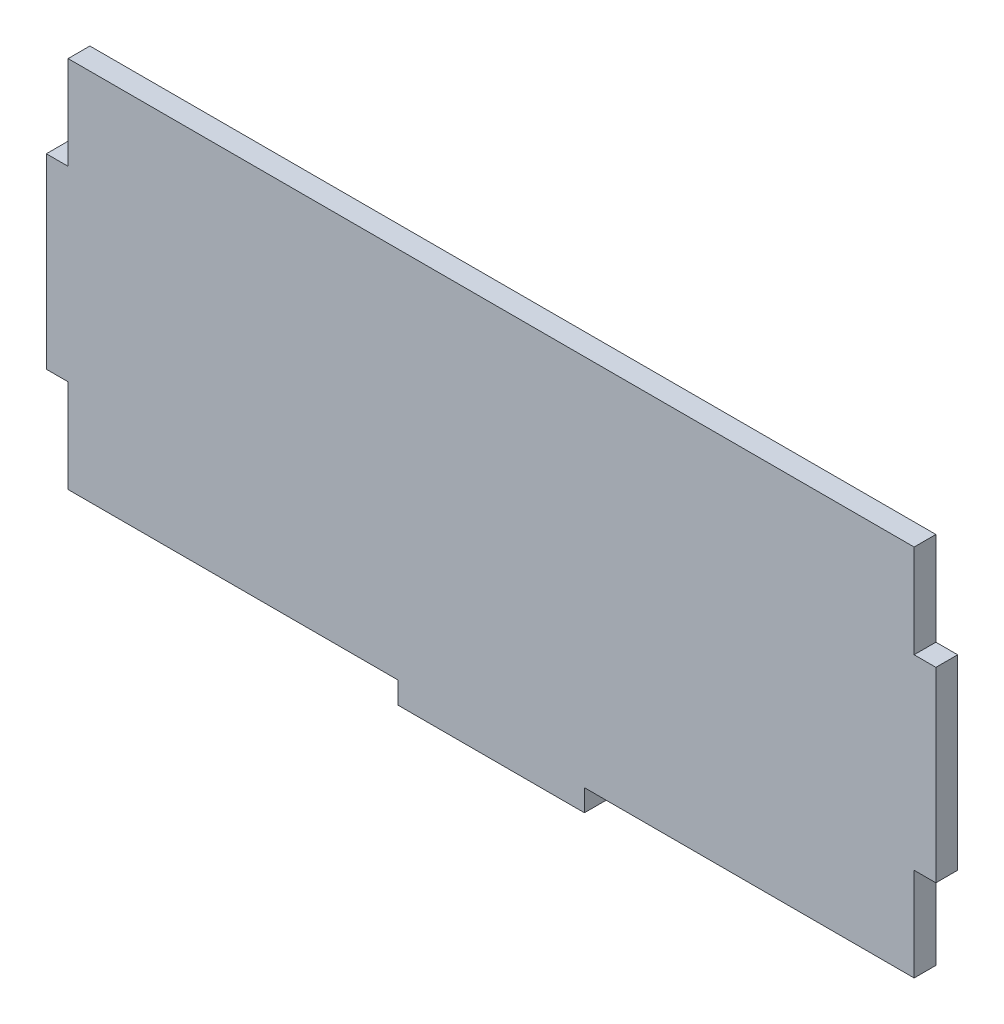
ISO-10303-21;
HEADER;
FILE_DESCRIPTION(('STEP AP214'),'2;1');
FILE_NAME('part.step','',(''),(''),'','','');
FILE_SCHEMA(('AUTOMOTIVE_DESIGN { 1 0 10303 214 1 1 1 1 }'));
ENDSEC;
DATA;
#1=APPLICATION_CONTEXT('core data for automotive mechanical design processes');
#2=APPLICATION_PROTOCOL_DEFINITION('international standard','automotive_design',2000,#1);
#3=PRODUCT_CONTEXT('',#1,'mechanical');
#4=PRODUCT('Part','Part','',(#3));
#5=PRODUCT_RELATED_PRODUCT_CATEGORY('part','',(#4));
#6=PRODUCT_DEFINITION_FORMATION('','',#4);
#7=PRODUCT_DEFINITION_CONTEXT('part definition',#1,'design');
#8=PRODUCT_DEFINITION('design','',#6,#7);
#9=PRODUCT_DEFINITION_SHAPE('','',#8);
#10=(LENGTH_UNIT() NAMED_UNIT(*) SI_UNIT(.MILLI.,.METRE.));
#11=(NAMED_UNIT(*) PLANE_ANGLE_UNIT() SI_UNIT($,.RADIAN.));
#12=(NAMED_UNIT(*) SI_UNIT($,.STERADIAN.) SOLID_ANGLE_UNIT());
#13=UNCERTAINTY_MEASURE_WITH_UNIT(LENGTH_MEASURE(1.E-05),#10,'distance_accuracy_value','');
#14=(GEOMETRIC_REPRESENTATION_CONTEXT(3) GLOBAL_UNCERTAINTY_ASSIGNED_CONTEXT((#13)) GLOBAL_UNIT_ASSIGNED_CONTEXT((#10,
#11,#12)) REPRESENTATION_CONTEXT('',''));
#15=CARTESIAN_POINT('',(0.,0.,0.));
#16=DIRECTION('',(0.,0.,1.));
#17=DIRECTION('',(1.,0.,0.));
#18=AXIS2_PLACEMENT_3D('',#15,#16,#17);
#19=CARTESIAN_POINT('',(0.,0.,3.5));
#20=DIRECTION('',(0.,1.,0.));
#21=DIRECTION('',(0.,0.,1.));
#22=AXIS2_PLACEMENT_3D('',#19,#20,#21);
#23=PLANE('',#22);
#24=DIRECTION('',(1.,0.,0.));
#25=VECTOR('',#24,1.);
#26=CARTESIAN_POINT('',(0.,0.,0.));
#27=LINE('',#26,#25);
#28=CARTESIAN_POINT('',(0.,0.,0.));
#29=VERTEX_POINT('',#28);
#30=CARTESIAN_POINT('',(53.,0.,0.));
#31=VERTEX_POINT('',#30);
#32=EDGE_CURVE('E183',#29,#31,#27,.T.);
#33=ORIENTED_EDGE('',*,*,#32,.T.);
#34=DIRECTION('',(0.,0.,-1.));
#35=VECTOR('',#34,1.);
#36=CARTESIAN_POINT('',(53.,0.,3.5));
#37=LINE('',#36,#35);
#38=CARTESIAN_POINT('',(53.,0.,3.5));
#39=VERTEX_POINT('',#38);
#40=EDGE_CURVE('E11',#39,#31,#37,.T.);
#41=ORIENTED_EDGE('',*,*,#40,.F.);
#42=DIRECTION('',(1.,0.,0.));
#43=VECTOR('',#42,1.);
#44=CARTESIAN_POINT('',(0.,0.,3.5));
#45=LINE('',#44,#43);
#46=CARTESIAN_POINT('',(0.,0.,3.5));
#47=VERTEX_POINT('',#46);
#48=EDGE_CURVE('E264',#47,#39,#45,.T.);
#49=ORIENTED_EDGE('',*,*,#48,.F.);
#50=DIRECTION('',(0.,0.,-1.));
#51=VECTOR('',#50,1.);
#52=CARTESIAN_POINT('',(0.,0.,3.5));
#53=LINE('',#52,#51);
#54=EDGE_CURVE('E52',#47,#29,#53,.T.);
#55=ORIENTED_EDGE('',*,*,#54,.T.);
#56=EDGE_LOOP('',(#33,#41,#49,#55));
#57=FACE_BOUND('',#56,.T.);
#58=ADVANCED_FACE('F35',(#57),#23,.F.);
#59=CARTESIAN_POINT('',(53.,0.,3.5));
#60=DIRECTION('',(1.,0.,0.));
#61=DIRECTION('',(0.,0.,-1.));
#62=AXIS2_PLACEMENT_3D('',#59,#60,#61);
#63=PLANE('',#62);
#64=DIRECTION('',(0.,-1.,0.));
#65=VECTOR('',#64,1.);
#66=CARTESIAN_POINT('',(53.,0.,0.));
#67=LINE('',#66,#65);
#68=CARTESIAN_POINT('',(53.,-3.5,0.));
#69=VERTEX_POINT('',#68);
#70=EDGE_CURVE('E185',#31,#69,#67,.T.);
#71=ORIENTED_EDGE('',*,*,#70,.T.);
#72=DIRECTION('',(0.,0.,-1.));
#73=VECTOR('',#72,1.);
#74=CARTESIAN_POINT('',(53.,-3.5,3.5));
#75=LINE('',#74,#73);
#76=CARTESIAN_POINT('',(53.,-3.5,3.5));
#77=VERTEX_POINT('',#76);
#78=EDGE_CURVE('E44',#77,#69,#75,.T.);
#79=ORIENTED_EDGE('',*,*,#78,.F.);
#80=DIRECTION('',(0.,-1.,0.));
#81=VECTOR('',#80,1.);
#82=CARTESIAN_POINT('',(53.,0.,3.5));
#83=LINE('',#82,#81);
#84=EDGE_CURVE('E114',#39,#77,#83,.T.);
#85=ORIENTED_EDGE('',*,*,#84,.F.);
#86=ORIENTED_EDGE('',*,*,#40,.T.);
#87=EDGE_LOOP('',(#71,#79,#85,#86));
#88=FACE_BOUND('',#87,.T.);
#89=ADVANCED_FACE('F37',(#88),#63,.F.);
#90=CARTESIAN_POINT('',(0.,-3.5,3.5));
#91=DIRECTION('',(0.,1.,0.));
#92=DIRECTION('',(0.,0.,1.));
#93=AXIS2_PLACEMENT_3D('',#90,#91,#92);
#94=PLANE('',#93);
#95=DIRECTION('',(1.,0.,0.));
#96=VECTOR('',#95,1.);
#97=CARTESIAN_POINT('',(0.,-3.5,0.));
#98=LINE('',#97,#96);
#99=CARTESIAN_POINT('',(83.,-3.5,0.));
#100=VERTEX_POINT('',#99);
#101=EDGE_CURVE('E188',#69,#100,#98,.T.);
#102=ORIENTED_EDGE('',*,*,#101,.T.);
#103=DIRECTION('',(0.,0.,-1.));
#104=VECTOR('',#103,1.);
#105=CARTESIAN_POINT('',(83.,-3.5,3.5));
#106=LINE('',#105,#104);
#107=CARTESIAN_POINT('',(83.,-3.5,3.5));
#108=VERTEX_POINT('',#107);
#109=EDGE_CURVE('E241',#108,#100,#106,.T.);
#110=ORIENTED_EDGE('',*,*,#109,.F.);
#111=DIRECTION('',(1.,0.,0.));
#112=VECTOR('',#111,1.);
#113=CARTESIAN_POINT('',(0.,-3.5,3.5));
#114=LINE('',#113,#112);
#115=EDGE_CURVE('E248',#77,#108,#114,.T.);
#116=ORIENTED_EDGE('',*,*,#115,.F.);
#117=ORIENTED_EDGE('',*,*,#78,.T.);
#118=EDGE_LOOP('',(#102,#110,#116,#117));
#119=FACE_BOUND('',#118,.T.);
#120=ADVANCED_FACE('F246',(#119),#94,.F.);
#121=CARTESIAN_POINT('',(83.,3.29101825156743E-13,3.5));
#122=DIRECTION('',(1.,0.,0.));
#123=DIRECTION('',(0.,1.,0.));
#124=AXIS2_PLACEMENT_3D('',#121,#122,#123);
#125=PLANE('',#124);
#126=DIRECTION('',(0.,-1.,0.));
#127=VECTOR('',#126,1.);
#128=CARTESIAN_POINT('',(83.,3.29101825156743E-13,0.));
#129=LINE('',#128,#127);
#130=CARTESIAN_POINT('',(83.,0.,0.));
#131=VERTEX_POINT('',#130);
#132=EDGE_CURVE('E191',#131,#100,#129,.T.);
#133=ORIENTED_EDGE('',*,*,#132,.F.);
#134=DIRECTION('',(0.,0.,-1.));
#135=VECTOR('',#134,1.);
#136=CARTESIAN_POINT('',(83.,0.,3.5));
#137=LINE('',#136,#135);
#138=CARTESIAN_POINT('',(83.,0.,3.5));
#139=VERTEX_POINT('',#138);
#140=EDGE_CURVE('E239',#139,#131,#137,.T.);
#141=ORIENTED_EDGE('',*,*,#140,.F.);
#142=DIRECTION('',(0.,-1.,0.));
#143=VECTOR('',#142,1.);
#144=CARTESIAN_POINT('',(83.,3.29101825156743E-13,3.5));
#145=LINE('',#144,#143);
#146=EDGE_CURVE('E259',#139,#108,#145,.T.);
#147=ORIENTED_EDGE('',*,*,#146,.T.);
#148=ORIENTED_EDGE('',*,*,#109,.T.);
#149=EDGE_LOOP('',(#133,#141,#147,#148));
#150=FACE_BOUND('',#149,.T.);
#151=ADVANCED_FACE('F255',(#150),#125,.T.);
#152=CARTESIAN_POINT('',(136.,0.,0.));
#153=VERTEX_POINT('',#152);
#154=EDGE_CURVE('E186',#131,#153,#27,.T.);
#155=ORIENTED_EDGE('',*,*,#154,.T.);
#156=DIRECTION('',(0.,0.,-1.));
#157=VECTOR('',#156,1.);
#158=CARTESIAN_POINT('',(136.,0.,3.5));
#159=LINE('',#158,#157);
#160=CARTESIAN_POINT('',(136.,0.,3.5));
#161=VERTEX_POINT('',#160);
#162=EDGE_CURVE('E236',#161,#153,#159,.T.);
#163=ORIENTED_EDGE('',*,*,#162,.F.);
#164=EDGE_CURVE('E260',#139,#161,#45,.T.);
#165=ORIENTED_EDGE('',*,*,#164,.F.);
#166=ORIENTED_EDGE('',*,*,#140,.T.);
#167=EDGE_LOOP('',(#155,#163,#165,#166));
#168=FACE_BOUND('',#167,.T.);
#169=ADVANCED_FACE('F308',(#168),#23,.F.);
#170=CARTESIAN_POINT('',(136.,0.,3.5));
#171=DIRECTION('',(-1.,0.,0.));
#172=DIRECTION('',(0.,0.,1.));
#173=AXIS2_PLACEMENT_3D('',#170,#171,#172);
#174=PLANE('',#173);
#175=DIRECTION('',(0.,1.,0.));
#176=VECTOR('',#175,1.);
#177=CARTESIAN_POINT('',(136.,0.,0.));
#178=LINE('',#177,#176);
#179=CARTESIAN_POINT('',(136.,15.,0.));
#180=VERTEX_POINT('',#179);
#181=EDGE_CURVE('E194',#153,#180,#178,.T.);
#182=ORIENTED_EDGE('',*,*,#181,.T.);
#183=DIRECTION('',(0.,0.,-1.));
#184=VECTOR('',#183,1.);
#185=CARTESIAN_POINT('',(136.,15.,3.5));
#186=LINE('',#185,#184);
#187=CARTESIAN_POINT('',(136.,15.,3.5));
#188=VERTEX_POINT('',#187);
#189=EDGE_CURVE('E233',#188,#180,#186,.T.);
#190=ORIENTED_EDGE('',*,*,#189,.F.);
#191=DIRECTION('',(0.,1.,0.));
#192=VECTOR('',#191,1.);
#193=CARTESIAN_POINT('',(136.,0.,3.5));
#194=LINE('',#193,#192);
#195=EDGE_CURVE('E262',#161,#188,#194,.T.);
#196=ORIENTED_EDGE('',*,*,#195,.F.);
#197=ORIENTED_EDGE('',*,*,#162,.T.);
#198=EDGE_LOOP('',(#182,#190,#196,#197));
#199=FACE_BOUND('',#198,.T.);
#200=ADVANCED_FACE('F315',(#199),#174,.F.);
#201=CARTESIAN_POINT('',(0.,15.,3.5));
#202=DIRECTION('',(0.,1.,0.));
#203=DIRECTION('',(0.,0.,1.));
#204=AXIS2_PLACEMENT_3D('',#201,#202,#203);
#205=PLANE('',#204);
#206=DIRECTION('',(1.,0.,0.));
#207=VECTOR('',#206,1.);
#208=CARTESIAN_POINT('',(0.,15.,0.));
#209=LINE('',#208,#207);
#210=CARTESIAN_POINT('',(139.5,15.,0.));
#211=VERTEX_POINT('',#210);
#212=EDGE_CURVE('E196',#180,#211,#209,.T.);
#213=ORIENTED_EDGE('',*,*,#212,.T.);
#214=DIRECTION('',(0.,0.,-1.));
#215=VECTOR('',#214,1.);
#216=CARTESIAN_POINT('',(139.5,15.,3.5));
#217=LINE('',#216,#215);
#218=CARTESIAN_POINT('',(139.5,15.,3.5));
#219=VERTEX_POINT('',#218);
#220=EDGE_CURVE('E231',#219,#211,#217,.T.);
#221=ORIENTED_EDGE('',*,*,#220,.F.);
#222=DIRECTION('',(1.,0.,0.));
#223=VECTOR('',#222,1.);
#224=CARTESIAN_POINT('',(0.,15.,3.5));
#225=LINE('',#224,#223);
#226=EDGE_CURVE('E269',#188,#219,#225,.T.);
#227=ORIENTED_EDGE('',*,*,#226,.F.);
#228=ORIENTED_EDGE('',*,*,#189,.T.);
#229=EDGE_LOOP('',(#213,#221,#227,#228));
#230=FACE_BOUND('',#229,.T.);
#231=ADVANCED_FACE('F321',(#230),#205,.F.);
#232=CARTESIAN_POINT('',(139.5,0.,3.5));
#233=DIRECTION('',(1.,0.,0.));
#234=DIRECTION('',(0.,0.,-1.));
#235=AXIS2_PLACEMENT_3D('',#232,#233,#234);
#236=PLANE('',#235);
#237=DIRECTION('',(0.,-1.,0.));
#238=VECTOR('',#237,1.);
#239=CARTESIAN_POINT('',(139.5,0.,0.));
#240=LINE('',#239,#238);
#241=CARTESIAN_POINT('',(139.5,45.,0.));
#242=VERTEX_POINT('',#241);
#243=EDGE_CURVE('E200',#242,#211,#240,.T.);
#244=ORIENTED_EDGE('',*,*,#243,.F.);
#245=DIRECTION('',(0.,0.,-1.));
#246=VECTOR('',#245,1.);
#247=CARTESIAN_POINT('',(139.5,45.,3.5));
#248=LINE('',#247,#246);
#249=CARTESIAN_POINT('',(139.5,45.,3.5));
#250=VERTEX_POINT('',#249);
#251=EDGE_CURVE('E229',#250,#242,#248,.T.);
#252=ORIENTED_EDGE('',*,*,#251,.F.);
#253=DIRECTION('',(0.,-1.,0.));
#254=VECTOR('',#253,1.);
#255=CARTESIAN_POINT('',(139.5,0.,3.5));
#256=LINE('',#255,#254);
#257=EDGE_CURVE('E272',#250,#219,#256,.T.);
#258=ORIENTED_EDGE('',*,*,#257,.T.);
#259=ORIENTED_EDGE('',*,*,#220,.T.);
#260=EDGE_LOOP('',(#244,#252,#258,#259));
#261=FACE_BOUND('',#260,.T.);
#262=ADVANCED_FACE('F344',(#261),#236,.T.);
#263=CARTESIAN_POINT('',(0.,45.,3.5));
#264=DIRECTION('',(0.,1.,0.));
#265=DIRECTION('',(0.,0.,1.));
#266=AXIS2_PLACEMENT_3D('',#263,#264,#265);
#267=PLANE('',#266);
#268=DIRECTION('',(1.,0.,0.));
#269=VECTOR('',#268,1.);
#270=CARTESIAN_POINT('',(0.,45.,0.));
#271=LINE('',#270,#269);
#272=CARTESIAN_POINT('',(136.,45.,0.));
#273=VERTEX_POINT('',#272);
#274=EDGE_CURVE('E203',#273,#242,#271,.T.);
#275=ORIENTED_EDGE('',*,*,#274,.F.);
#276=DIRECTION('',(0.,0.,-1.));
#277=VECTOR('',#276,1.);
#278=CARTESIAN_POINT('',(136.,45.,3.5));
#279=LINE('',#278,#277);
#280=CARTESIAN_POINT('',(136.,45.,3.5));
#281=VERTEX_POINT('',#280);
#282=EDGE_CURVE('E227',#281,#273,#279,.T.);
#283=ORIENTED_EDGE('',*,*,#282,.F.);
#284=DIRECTION('',(1.,0.,0.));
#285=VECTOR('',#284,1.);
#286=CARTESIAN_POINT('',(0.,45.,3.5));
#287=LINE('',#286,#285);
#288=EDGE_CURVE('E275',#281,#250,#287,.T.);
#289=ORIENTED_EDGE('',*,*,#288,.T.);
#290=ORIENTED_EDGE('',*,*,#251,.T.);
#291=EDGE_LOOP('',(#275,#283,#289,#290));
#292=FACE_BOUND('',#291,.T.);
#293=ADVANCED_FACE('F337',(#292),#267,.T.);
#294=CARTESIAN_POINT('',(136.,60.,0.));
#295=VERTEX_POINT('',#294);
#296=EDGE_CURVE('E197',#273,#295,#178,.T.);
#297=ORIENTED_EDGE('',*,*,#296,.T.);
#298=DIRECTION('',(0.,0.,-1.));
#299=VECTOR('',#298,1.);
#300=CARTESIAN_POINT('',(136.,60.,3.5));
#301=LINE('',#300,#299);
#302=CARTESIAN_POINT('',(136.,60.,3.5));
#303=VERTEX_POINT('',#302);
#304=EDGE_CURVE('E225',#303,#295,#301,.T.);
#305=ORIENTED_EDGE('',*,*,#304,.F.);
#306=EDGE_CURVE('E270',#281,#303,#194,.T.);
#307=ORIENTED_EDGE('',*,*,#306,.F.);
#308=ORIENTED_EDGE('',*,*,#282,.T.);
#309=EDGE_LOOP('',(#297,#305,#307,#308));
#310=FACE_BOUND('',#309,.T.);
#311=ADVANCED_FACE('F324',(#310),#174,.F.);
#312=CARTESIAN_POINT('',(0.,60.,3.5));
#313=DIRECTION('',(0.,1.,0.));
#314=DIRECTION('',(0.,0.,1.));
#315=AXIS2_PLACEMENT_3D('',#312,#313,#314);
#316=PLANE('',#315);
#317=DIRECTION('',(1.,0.,0.));
#318=VECTOR('',#317,1.);
#319=CARTESIAN_POINT('',(0.,60.,0.));
#320=LINE('',#319,#318);
#321=CARTESIAN_POINT('',(0.,60.,0.));
#322=VERTEX_POINT('',#321);
#323=EDGE_CURVE('E206',#322,#295,#320,.T.);
#324=ORIENTED_EDGE('',*,*,#323,.F.);
#325=DIRECTION('',(0.,0.,-1.));
#326=VECTOR('',#325,1.);
#327=CARTESIAN_POINT('',(0.,60.,3.5));
#328=LINE('',#327,#326);
#329=CARTESIAN_POINT('',(0.,60.,3.5));
#330=VERTEX_POINT('',#329);
#331=EDGE_CURVE('E223',#330,#322,#328,.T.);
#332=ORIENTED_EDGE('',*,*,#331,.F.);
#333=DIRECTION('',(1.,0.,0.));
#334=VECTOR('',#333,1.);
#335=CARTESIAN_POINT('',(0.,60.,3.5));
#336=LINE('',#335,#334);
#337=EDGE_CURVE('E278',#330,#303,#336,.T.);
#338=ORIENTED_EDGE('',*,*,#337,.T.);
#339=ORIENTED_EDGE('',*,*,#304,.T.);
#340=EDGE_LOOP('',(#324,#332,#338,#339));
#341=FACE_BOUND('',#340,.T.);
#342=ADVANCED_FACE('F290',(#341),#316,.T.);
#343=CARTESIAN_POINT('',(0.,0.,3.5));
#344=DIRECTION('',(-1.,0.,0.));
#345=DIRECTION('',(0.,0.,1.));
#346=AXIS2_PLACEMENT_3D('',#343,#344,#345);
#347=PLANE('',#346);
#348=DIRECTION('',(0.,1.,0.));
#349=VECTOR('',#348,1.);
#350=CARTESIAN_POINT('',(0.,0.,0.));
#351=LINE('',#350,#349);
#352=CARTESIAN_POINT('',(0.,45.,0.));
#353=VERTEX_POINT('',#352);
#354=EDGE_CURVE('E209',#353,#322,#351,.T.);
#355=ORIENTED_EDGE('',*,*,#354,.F.);
#356=DIRECTION('',(0.,0.,-1.));
#357=VECTOR('',#356,1.);
#358=CARTESIAN_POINT('',(0.,45.,3.5));
#359=LINE('',#358,#357);
#360=CARTESIAN_POINT('',(0.,45.,3.5));
#361=VERTEX_POINT('',#360);
#362=EDGE_CURVE('E221',#361,#353,#359,.T.);
#363=ORIENTED_EDGE('',*,*,#362,.F.);
#364=DIRECTION('',(0.,1.,0.));
#365=VECTOR('',#364,1.);
#366=CARTESIAN_POINT('',(0.,0.,3.5));
#367=LINE('',#366,#365);
#368=EDGE_CURVE('E180',#361,#330,#367,.T.);
#369=ORIENTED_EDGE('',*,*,#368,.T.);
#370=ORIENTED_EDGE('',*,*,#331,.T.);
#371=EDGE_LOOP('',(#355,#363,#369,#370));
#372=FACE_BOUND('',#371,.T.);
#373=ADVANCED_FACE('F283',(#372),#347,.T.);
#374=CARTESIAN_POINT('',(0.,45.,3.5));
#375=DIRECTION('',(0.,-1.,0.));
#376=DIRECTION('',(0.,0.,-1.));
#377=AXIS2_PLACEMENT_3D('',#374,#375,#376);
#378=PLANE('',#377);
#379=DIRECTION('',(-1.,0.,0.));
#380=VECTOR('',#379,1.);
#381=CARTESIAN_POINT('',(0.,45.,0.));
#382=LINE('',#381,#380);
#383=CARTESIAN_POINT('',(-3.5,45.,0.));
#384=VERTEX_POINT('',#383);
#385=EDGE_CURVE('E212',#353,#384,#382,.T.);
#386=ORIENTED_EDGE('',*,*,#385,.T.);
#387=DIRECTION('',(0.,0.,-1.));
#388=VECTOR('',#387,1.);
#389=CARTESIAN_POINT('',(-3.5,45.,3.5));
#390=LINE('',#389,#388);
#391=CARTESIAN_POINT('',(-3.5,45.,3.5));
#392=VERTEX_POINT('',#391);
#393=EDGE_CURVE('E174',#392,#384,#390,.T.);
#394=ORIENTED_EDGE('',*,*,#393,.F.);
#395=DIRECTION('',(-1.,0.,0.));
#396=VECTOR('',#395,1.);
#397=CARTESIAN_POINT('',(0.,45.,3.5));
#398=LINE('',#397,#396);
#399=EDGE_CURVE('E162',#361,#392,#398,.T.);
#400=ORIENTED_EDGE('',*,*,#399,.F.);
#401=ORIENTED_EDGE('',*,*,#362,.T.);
#402=EDGE_LOOP('',(#386,#394,#400,#401));
#403=FACE_BOUND('',#402,.T.);
#404=ADVANCED_FACE('F295',(#403),#378,.F.);
#405=CARTESIAN_POINT('',(-3.5,0.,3.5));
#406=DIRECTION('',(1.,0.,0.));
#407=DIRECTION('',(0.,0.,-1.));
#408=AXIS2_PLACEMENT_3D('',#405,#406,#407);
#409=PLANE('',#408);
#410=DIRECTION('',(0.,-1.,0.));
#411=VECTOR('',#410,1.);
#412=CARTESIAN_POINT('',(-3.5,0.,0.));
#413=LINE('',#412,#411);
#414=CARTESIAN_POINT('',(-3.5,15.,0.));
#415=VERTEX_POINT('',#414);
#416=EDGE_CURVE('E171',#384,#415,#413,.T.);
#417=ORIENTED_EDGE('',*,*,#416,.T.);
#418=DIRECTION('',(0.,0.,-1.));
#419=VECTOR('',#418,1.);
#420=CARTESIAN_POINT('',(-3.5,15.,3.5));
#421=LINE('',#420,#419);
#422=CARTESIAN_POINT('',(-3.5,15.,3.5));
#423=VERTEX_POINT('',#422);
#424=EDGE_CURVE('E168',#423,#415,#421,.T.);
#425=ORIENTED_EDGE('',*,*,#424,.F.);
#426=DIRECTION('',(0.,-1.,0.));
#427=VECTOR('',#426,1.);
#428=CARTESIAN_POINT('',(-3.5,0.,3.5));
#429=LINE('',#428,#427);
#430=EDGE_CURVE('E154',#392,#423,#429,.T.);
#431=ORIENTED_EDGE('',*,*,#430,.F.);
#432=ORIENTED_EDGE('',*,*,#393,.T.);
#433=EDGE_LOOP('',(#417,#425,#431,#432));
#434=FACE_BOUND('',#433,.T.);
#435=ADVANCED_FACE('F169',(#434),#409,.F.);
#436=CARTESIAN_POINT('',(0.,15.,3.5));
#437=DIRECTION('',(0.,-1.,0.));
#438=DIRECTION('',(0.,0.,-1.));
#439=AXIS2_PLACEMENT_3D('',#436,#437,#438);
#440=PLANE('',#439);
#441=DIRECTION('',(-1.,0.,0.));
#442=VECTOR('',#441,1.);
#443=CARTESIAN_POINT('',(0.,15.,0.));
#444=LINE('',#443,#442);
#445=CARTESIAN_POINT('',(0.,15.,0.));
#446=VERTEX_POINT('',#445);
#447=EDGE_CURVE('E216',#446,#415,#444,.T.);
#448=ORIENTED_EDGE('',*,*,#447,.F.);
#449=DIRECTION('',(0.,0.,-1.));
#450=VECTOR('',#449,1.);
#451=CARTESIAN_POINT('',(0.,15.,3.5));
#452=LINE('',#451,#450);
#453=CARTESIAN_POINT('',(0.,15.,3.5));
#454=VERTEX_POINT('',#453);
#455=EDGE_CURVE('E102',#454,#446,#452,.T.);
#456=ORIENTED_EDGE('',*,*,#455,.F.);
#457=DIRECTION('',(-1.,0.,0.));
#458=VECTOR('',#457,1.);
#459=CARTESIAN_POINT('',(0.,15.,3.5));
#460=LINE('',#459,#458);
#461=EDGE_CURVE('E159',#454,#423,#460,.T.);
#462=ORIENTED_EDGE('',*,*,#461,.T.);
#463=ORIENTED_EDGE('',*,*,#424,.T.);
#464=EDGE_LOOP('',(#448,#456,#462,#463));
#465=FACE_BOUND('',#464,.T.);
#466=ADVANCED_FACE('F176',(#465),#440,.T.);
#467=EDGE_CURVE('E213',#29,#446,#351,.T.);
#468=ORIENTED_EDGE('',*,*,#467,.F.);
#469=ORIENTED_EDGE('',*,*,#54,.F.);
#470=EDGE_CURVE('E177',#47,#454,#367,.T.);
#471=ORIENTED_EDGE('',*,*,#470,.T.);
#472=ORIENTED_EDGE('',*,*,#455,.T.);
#473=EDGE_LOOP('',(#468,#469,#471,#472));
#474=FACE_BOUND('',#473,.T.);
#475=ADVANCED_FACE('F304',(#474),#347,.T.);
#476=CARTESIAN_POINT('',(0.,0.,3.5));
#477=DIRECTION('',(0.,0.,1.));
#478=DIRECTION('',(1.,0.,0.));
#479=AXIS2_PLACEMENT_3D('',#476,#477,#478);
#480=PLANE('',#479);
#481=ORIENTED_EDGE('',*,*,#48,.T.);
#482=ORIENTED_EDGE('',*,*,#84,.T.);
#483=ORIENTED_EDGE('',*,*,#115,.T.);
#484=ORIENTED_EDGE('',*,*,#146,.F.);
#485=ORIENTED_EDGE('',*,*,#164,.T.);
#486=ORIENTED_EDGE('',*,*,#195,.T.);
#487=ORIENTED_EDGE('',*,*,#226,.T.);
#488=ORIENTED_EDGE('',*,*,#257,.F.);
#489=ORIENTED_EDGE('',*,*,#288,.F.);
#490=ORIENTED_EDGE('',*,*,#306,.T.);
#491=ORIENTED_EDGE('',*,*,#337,.F.);
#492=ORIENTED_EDGE('',*,*,#368,.F.);
#493=ORIENTED_EDGE('',*,*,#399,.T.);
#494=ORIENTED_EDGE('',*,*,#430,.T.);
#495=ORIENTED_EDGE('',*,*,#461,.F.);
#496=ORIENTED_EDGE('',*,*,#470,.F.);
#497=EDGE_LOOP('',(#481,#482,#483,#484,#485,#486,#487,#488,#489,#490,#491,#492,#493,#494,#495,#496));
#498=FACE_BOUND('',#497,.T.);
#499=ADVANCED_FACE('F156',(#498),#480,.T.);
#500=CARTESIAN_POINT('',(0.,0.,0.));
#501=DIRECTION('',(0.,0.,1.));
#502=DIRECTION('',(1.,0.,0.));
#503=AXIS2_PLACEMENT_3D('',#500,#501,#502);
#504=PLANE('',#503);
#505=ORIENTED_EDGE('',*,*,#32,.F.);
#506=ORIENTED_EDGE('',*,*,#467,.T.);
#507=ORIENTED_EDGE('',*,*,#447,.T.);
#508=ORIENTED_EDGE('',*,*,#416,.F.);
#509=ORIENTED_EDGE('',*,*,#385,.F.);
#510=ORIENTED_EDGE('',*,*,#354,.T.);
#511=ORIENTED_EDGE('',*,*,#323,.T.);
#512=ORIENTED_EDGE('',*,*,#296,.F.);
#513=ORIENTED_EDGE('',*,*,#274,.T.);
#514=ORIENTED_EDGE('',*,*,#243,.T.);
#515=ORIENTED_EDGE('',*,*,#212,.F.);
#516=ORIENTED_EDGE('',*,*,#181,.F.);
#517=ORIENTED_EDGE('',*,*,#154,.F.);
#518=ORIENTED_EDGE('',*,*,#132,.T.);
#519=ORIENTED_EDGE('',*,*,#101,.F.);
#520=ORIENTED_EDGE('',*,*,#70,.F.);
#521=EDGE_LOOP('',(#505,#506,#507,#508,#509,#510,#511,#512,#513,#514,#515,#516,#517,#518,#519,#520));
#522=FACE_BOUND('',#521,.T.);
#523=ADVANCED_FACE('F250',(#522),#504,.F.);
#524=CLOSED_SHELL('',(#58,#89,#120,#151,#169,#200,#231,#262,#293,#311,#342,#373,#404,#435,#466,
#475,#499,#523));
#525=MANIFOLD_SOLID_BREP('B2',#524);
#526=ADVANCED_BREP_SHAPE_REPRESENTATION('',(#18,#525),#14);
#527=SHAPE_DEFINITION_REPRESENTATION(#9,#526);
ENDSEC;
END-ISO-10303-21;
